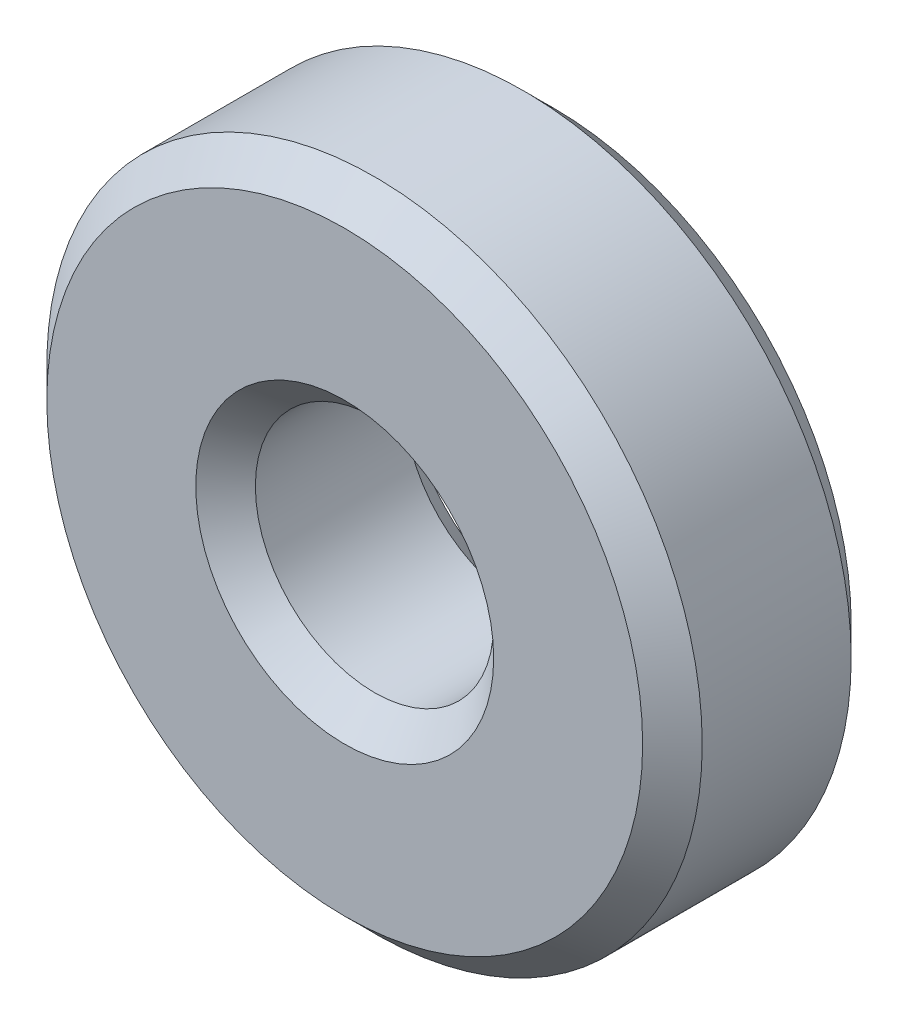
ISO-10303-21;
HEADER;
FILE_DESCRIPTION(('STEP AP214'),'2;1');
FILE_NAME('part.step','',(''),(''),'','','');
FILE_SCHEMA(('AUTOMOTIVE_DESIGN { 1 0 10303 214 1 1 1 1 }'));
ENDSEC;
DATA;
#1=APPLICATION_CONTEXT('core data for automotive mechanical design processes');
#2=APPLICATION_PROTOCOL_DEFINITION('international standard','automotive_design',2000,#1);
#3=PRODUCT_CONTEXT('',#1,'mechanical');
#4=PRODUCT('Part','Part','',(#3));
#5=PRODUCT_RELATED_PRODUCT_CATEGORY('part','',(#4));
#6=PRODUCT_DEFINITION_FORMATION('','',#4);
#7=PRODUCT_DEFINITION_CONTEXT('part definition',#1,'design');
#8=PRODUCT_DEFINITION('design','',#6,#7);
#9=PRODUCT_DEFINITION_SHAPE('','',#8);
#10=(LENGTH_UNIT() NAMED_UNIT(*) SI_UNIT(.MILLI.,.METRE.));
#11=(NAMED_UNIT(*) PLANE_ANGLE_UNIT() SI_UNIT($,.RADIAN.));
#12=(NAMED_UNIT(*) SI_UNIT($,.STERADIAN.) SOLID_ANGLE_UNIT());
#13=UNCERTAINTY_MEASURE_WITH_UNIT(LENGTH_MEASURE(1.E-05),#10,'distance_accuracy_value','');
#14=(GEOMETRIC_REPRESENTATION_CONTEXT(3) GLOBAL_UNCERTAINTY_ASSIGNED_CONTEXT((#13)) GLOBAL_UNIT_ASSIGNED_CONTEXT((#10,
#11,#12)) REPRESENTATION_CONTEXT('',''));
#15=CARTESIAN_POINT('',(0.,0.,0.));
#16=DIRECTION('',(0.,0.,1.));
#17=DIRECTION('',(1.,0.,0.));
#18=AXIS2_PLACEMENT_3D('',#15,#16,#17);
#19=CARTESIAN_POINT('',(0.,0.,7.));
#20=DIRECTION('',(0.,0.,1.));
#21=DIRECTION('',(1.,0.,0.));
#22=AXIS2_PLACEMENT_3D('',#19,#20,#21);
#23=PLANE('',#22);
#24=CARTESIAN_POINT('',(0.,0.,7.));
#25=DIRECTION('',(0.,0.,1.));
#26=DIRECTION('',(1.,0.,0.));
#27=AXIS2_PLACEMENT_3D('',#24,#25,#26);
#28=CIRCLE('',#27,5.);
#29=CARTESIAN_POINT('',(5.,0.,7.));
#30=VERTEX_POINT('',#29);
#31=EDGE_CURVE('E41',#30,#30,#28,.F.);
#32=ORIENTED_EDGE('',*,*,#31,.T.);
#33=EDGE_LOOP('',(#32));
#34=FACE_BOUND('',#33,.T.);
#35=CARTESIAN_POINT('',(0.,0.,7.));
#36=DIRECTION('',(0.,0.,1.));
#37=DIRECTION('',(1.,0.,0.));
#38=AXIS2_PLACEMENT_3D('',#35,#36,#37);
#39=CIRCLE('',#38,10.);
#40=CARTESIAN_POINT('',(10.,0.,7.));
#41=VERTEX_POINT('',#40);
#42=EDGE_CURVE('E45',#41,#41,#39,.T.);
#43=ORIENTED_EDGE('',*,*,#42,.T.);
#44=EDGE_LOOP('',(#43));
#45=FACE_BOUND('',#44,.T.);
#46=ADVANCED_FACE('F30',(#34,#45),#23,.T.);
#47=CARTESIAN_POINT('',(0.,0.,0.));
#48=DIRECTION('',(0.,0.,1.));
#49=DIRECTION('',(1.,0.,0.));
#50=AXIS2_PLACEMENT_3D('',#47,#48,#49);
#51=PLANE('',#50);
#52=CARTESIAN_POINT('',(0.,0.,0.));
#53=DIRECTION('',(0.,0.,1.));
#54=DIRECTION('',(1.,0.,0.));
#55=AXIS2_PLACEMENT_3D('',#52,#53,#54);
#56=CIRCLE('',#55,4.99999999999999);
#57=CARTESIAN_POINT('',(4.99999999999999,0.,0.));
#58=VERTEX_POINT('',#57);
#59=EDGE_CURVE('E56',#58,#58,#56,.T.);
#60=ORIENTED_EDGE('',*,*,#59,.T.);
#61=EDGE_LOOP('',(#60));
#62=FACE_BOUND('',#61,.T.);
#63=CARTESIAN_POINT('',(0.,0.,0.));
#64=DIRECTION('',(0.,0.,1.));
#65=DIRECTION('',(1.,0.,0.));
#66=AXIS2_PLACEMENT_3D('',#63,#64,#65);
#67=CIRCLE('',#66,10.);
#68=CARTESIAN_POINT('',(10.,0.,0.));
#69=VERTEX_POINT('',#68);
#70=EDGE_CURVE('E59',#69,#69,#67,.F.);
#71=ORIENTED_EDGE('',*,*,#70,.T.);
#72=EDGE_LOOP('',(#71));
#73=FACE_BOUND('',#72,.T.);
#74=ADVANCED_FACE('F63',(#62,#73),#51,.F.);
#75=CARTESIAN_POINT('',(0.,0.,7.));
#76=DIRECTION('',(0.,0.,-1.));
#77=DIRECTION('',(-1.,0.,0.));
#78=AXIS2_PLACEMENT_3D('',#75,#76,#77);
#79=CYLINDRICAL_SURFACE('',#78,11.);
#80=CARTESIAN_POINT('',(0.,0.,0.999999999999997));
#81=DIRECTION('',(0.,0.,1.));
#82=DIRECTION('',(1.,0.,0.));
#83=AXIS2_PLACEMENT_3D('',#80,#81,#82);
#84=CIRCLE('',#83,11.);
#85=CARTESIAN_POINT('',(11.,0.,0.999999999999997));
#86=VERTEX_POINT('',#85);
#87=EDGE_CURVE('E10',#86,#86,#84,.T.);
#88=ORIENTED_EDGE('',*,*,#87,.T.);
#89=EDGE_LOOP('',(#88));
#90=FACE_BOUND('',#89,.T.);
#91=CARTESIAN_POINT('',(0.,0.,6.00000000000001));
#92=DIRECTION('',(0.,0.,1.));
#93=DIRECTION('',(1.,0.,0.));
#94=AXIS2_PLACEMENT_3D('',#91,#92,#93);
#95=CIRCLE('',#94,11.);
#96=CARTESIAN_POINT('',(11.,0.,6.00000000000001));
#97=VERTEX_POINT('',#96);
#98=EDGE_CURVE('E37',#97,#97,#95,.F.);
#99=ORIENTED_EDGE('',*,*,#98,.T.);
#100=EDGE_LOOP('',(#99));
#101=FACE_BOUND('',#100,.T.);
#102=ADVANCED_FACE('F83',(#90,#101),#79,.T.);
#103=CARTESIAN_POINT('',(0.,0.,7.));
#104=DIRECTION('',(0.,0.,-1.));
#105=DIRECTION('',(-1.,0.,0.));
#106=AXIS2_PLACEMENT_3D('',#103,#104,#105);
#107=CYLINDRICAL_SURFACE('',#106,4.);
#108=CARTESIAN_POINT('',(0.,0.,0.999999999999997));
#109=DIRECTION('',(0.,0.,1.));
#110=DIRECTION('',(1.,0.,0.));
#111=AXIS2_PLACEMENT_3D('',#108,#109,#110);
#112=CIRCLE('',#111,4.);
#113=CARTESIAN_POINT('',(4.,0.,0.999999999999997));
#114=VERTEX_POINT('',#113);
#115=EDGE_CURVE('E50',#114,#114,#112,.F.);
#116=ORIENTED_EDGE('',*,*,#115,.T.);
#117=EDGE_LOOP('',(#116));
#118=FACE_BOUND('',#117,.T.);
#119=CARTESIAN_POINT('',(0.,0.,6.));
#120=DIRECTION('',(0.,0.,1.));
#121=DIRECTION('',(1.,0.,0.));
#122=AXIS2_PLACEMENT_3D('',#119,#120,#121);
#123=CIRCLE('',#122,4.);
#124=CARTESIAN_POINT('',(4.,0.,6.));
#125=VERTEX_POINT('',#124);
#126=EDGE_CURVE('E53',#125,#125,#123,.T.);
#127=ORIENTED_EDGE('',*,*,#126,.T.);
#128=EDGE_LOOP('',(#127));
#129=FACE_BOUND('',#128,.T.);
#130=ADVANCED_FACE('F88',(#118,#129),#107,.F.);
#131=CARTESIAN_POINT('',(0.,0.,0.));
#132=DIRECTION('',(0.,0.,-1.));
#133=DIRECTION('',(-1.,0.,0.));
#134=AXIS2_PLACEMENT_3D('',#131,#132,#133);
#135=CONICAL_SURFACE('',#134,4.99999999999999,0.785398163397447);
#136=ORIENTED_EDGE('',*,*,#115,.F.);
#137=EDGE_LOOP('',(#136));
#138=FACE_BOUND('',#137,.T.);
#139=ORIENTED_EDGE('',*,*,#59,.F.);
#140=EDGE_LOOP('',(#139));
#141=FACE_BOUND('',#140,.T.);
#142=ADVANCED_FACE('F74',(#138,#141),#135,.F.);
#143=CARTESIAN_POINT('',(0.,0.,6.));
#144=DIRECTION('',(0.,0.,1.));
#145=DIRECTION('',(1.,0.,0.));
#146=AXIS2_PLACEMENT_3D('',#143,#144,#145);
#147=CONICAL_SURFACE('',#146,4.,0.78539816339745);
#148=ORIENTED_EDGE('',*,*,#31,.F.);
#149=EDGE_LOOP('',(#148));
#150=FACE_BOUND('',#149,.T.);
#151=ORIENTED_EDGE('',*,*,#126,.F.);
#152=EDGE_LOOP('',(#151));
#153=FACE_BOUND('',#152,.T.);
#154=ADVANCED_FACE('F68',(#150,#153),#147,.F.);
#155=CARTESIAN_POINT('',(0.,0.,0.999999999999997));
#156=DIRECTION('',(0.,0.,1.));
#157=DIRECTION('',(1.,0.,0.));
#158=AXIS2_PLACEMENT_3D('',#155,#156,#157);
#159=CONICAL_SURFACE('',#158,11.,0.785398163397451);
#160=ORIENTED_EDGE('',*,*,#70,.F.);
#161=EDGE_LOOP('',(#160));
#162=FACE_BOUND('',#161,.T.);
#163=ORIENTED_EDGE('',*,*,#87,.F.);
#164=EDGE_LOOP('',(#163));
#165=FACE_BOUND('',#164,.T.);
#166=ADVANCED_FACE('F65',(#162,#165),#159,.T.);
#167=CARTESIAN_POINT('',(0.,0.,7.));
#168=DIRECTION('',(0.,0.,-1.));
#169=DIRECTION('',(-1.,0.,0.));
#170=AXIS2_PLACEMENT_3D('',#167,#168,#169);
#171=CONICAL_SURFACE('',#170,10.,0.785398163397448);
#172=ORIENTED_EDGE('',*,*,#98,.F.);
#173=EDGE_LOOP('',(#172));
#174=FACE_BOUND('',#173,.T.);
#175=ORIENTED_EDGE('',*,*,#42,.F.);
#176=EDGE_LOOP('',(#175));
#177=FACE_BOUND('',#176,.T.);
#178=ADVANCED_FACE('F32',(#174,#177),#171,.T.);
#179=CLOSED_SHELL('',(#46,#74,#102,#130,#142,#154,#166,#178));
#180=MANIFOLD_SOLID_BREP('B2',#179);
#181=ADVANCED_BREP_SHAPE_REPRESENTATION('',(#18,#180),#14);
#182=SHAPE_DEFINITION_REPRESENTATION(#9,#181);
ENDSEC;
END-ISO-10303-21;
